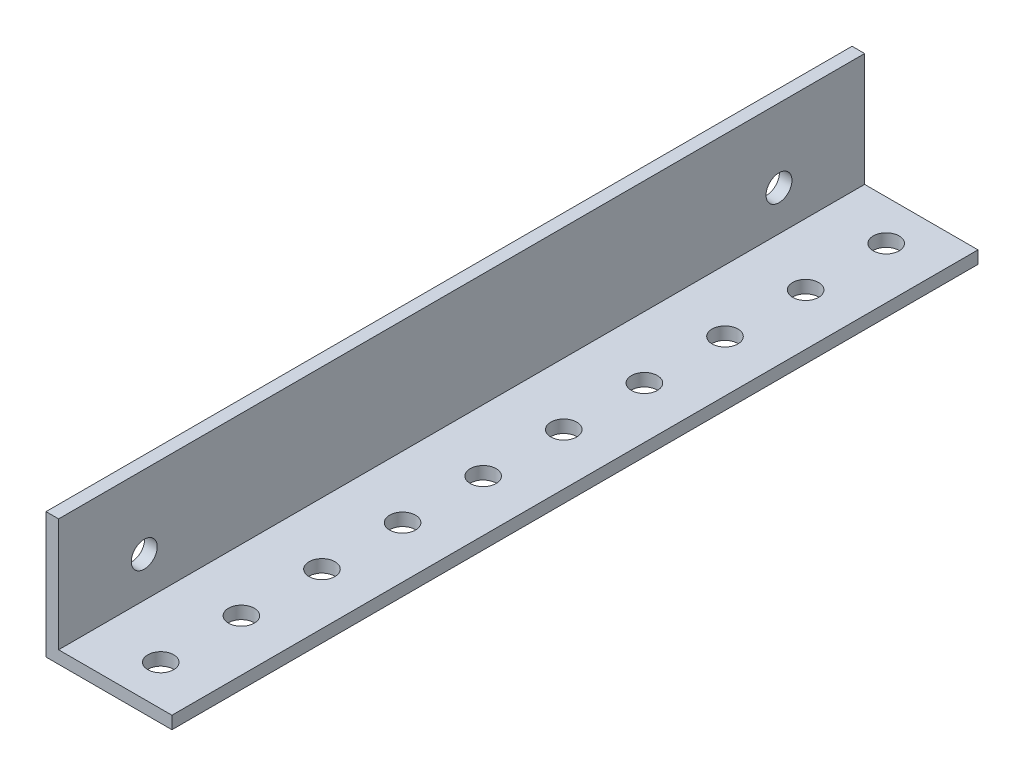
ISO-10303-21;
HEADER;
FILE_DESCRIPTION(('STEP AP214'),'2;1');
FILE_NAME('part.step','',(''),(''),'','','');
FILE_SCHEMA(('AUTOMOTIVE_DESIGN { 1 0 10303 214 1 1 1 1 }'));
ENDSEC;
DATA;
#1=APPLICATION_CONTEXT('core data for automotive mechanical design processes');
#2=APPLICATION_PROTOCOL_DEFINITION('international standard','automotive_design',2000,#1);
#3=PRODUCT_CONTEXT('',#1,'mechanical');
#4=PRODUCT('Part','Part','',(#3));
#5=PRODUCT_RELATED_PRODUCT_CATEGORY('part','',(#4));
#6=PRODUCT_DEFINITION_FORMATION('','',#4);
#7=PRODUCT_DEFINITION_CONTEXT('part definition',#1,'design');
#8=PRODUCT_DEFINITION('design','',#6,#7);
#9=PRODUCT_DEFINITION_SHAPE('','',#8);
#10=(LENGTH_UNIT() NAMED_UNIT(*) SI_UNIT(.MILLI.,.METRE.));
#11=(NAMED_UNIT(*) PLANE_ANGLE_UNIT() SI_UNIT($,.RADIAN.));
#12=(NAMED_UNIT(*) SI_UNIT($,.STERADIAN.) SOLID_ANGLE_UNIT());
#13=UNCERTAINTY_MEASURE_WITH_UNIT(LENGTH_MEASURE(1.E-05),#10,'distance_accuracy_value','');
#14=(GEOMETRIC_REPRESENTATION_CONTEXT(3) GLOBAL_UNCERTAINTY_ASSIGNED_CONTEXT((#13)) GLOBAL_UNIT_ASSIGNED_CONTEXT((#10,
#11,#12)) REPRESENTATION_CONTEXT('',''));
#15=CARTESIAN_POINT('',(0.,0.,0.));
#16=DIRECTION('',(0.,0.,1.));
#17=DIRECTION('',(1.,0.,0.));
#18=AXIS2_PLACEMENT_3D('',#15,#16,#17);
#19=CARTESIAN_POINT('',(1.5875,1.5875,50.8));
#20=DIRECTION('',(0.,-1.,0.));
#21=DIRECTION('',(1.,0.,0.));
#22=AXIS2_PLACEMENT_3D('',#19,#20,#21);
#23=PLANE('',#22);
#24=CARTESIAN_POINT('',(9.3853,1.5875,45.72));
#25=DIRECTION('',(0.,1.,0.));
#26=DIRECTION('',(0.,0.,1.));
#27=AXIS2_PLACEMENT_3D('',#24,#25,#26);
#28=CIRCLE('',#27,1.63194999999999);
#29=CARTESIAN_POINT('',(9.3853,1.5875,47.35195));
#30=VERTEX_POINT('',#29);
#31=EDGE_CURVE('E188',#30,#30,#28,.T.);
#32=ORIENTED_EDGE('',*,*,#31,.F.);
#33=EDGE_LOOP('',(#32));
#34=FACE_BOUND('',#33,.T.);
#35=CARTESIAN_POINT('',(9.3853,1.5875,35.56));
#36=DIRECTION('',(0.,1.,0.));
#37=DIRECTION('',(0.,0.,1.));
#38=AXIS2_PLACEMENT_3D('',#35,#36,#37);
#39=CIRCLE('',#38,1.63194999999999);
#40=CARTESIAN_POINT('',(9.3853,1.5875,37.19195));
#41=VERTEX_POINT('',#40);
#42=EDGE_CURVE('E198',#41,#41,#39,.T.);
#43=ORIENTED_EDGE('',*,*,#42,.F.);
#44=EDGE_LOOP('',(#43));
#45=FACE_BOUND('',#44,.T.);
#46=CARTESIAN_POINT('',(9.3853,1.5875,25.4));
#47=DIRECTION('',(0.,1.,0.));
#48=DIRECTION('',(0.,0.,1.));
#49=AXIS2_PLACEMENT_3D('',#46,#47,#48);
#50=CIRCLE('',#49,1.63194999999999);
#51=CARTESIAN_POINT('',(9.3853,1.5875,27.03195));
#52=VERTEX_POINT('',#51);
#53=EDGE_CURVE('E204',#52,#52,#50,.T.);
#54=ORIENTED_EDGE('',*,*,#53,.F.);
#55=EDGE_LOOP('',(#54));
#56=FACE_BOUND('',#55,.T.);
#57=CARTESIAN_POINT('',(9.3853,1.5875,15.24));
#58=DIRECTION('',(0.,1.,0.));
#59=DIRECTION('',(0.,0.,1.));
#60=AXIS2_PLACEMENT_3D('',#57,#58,#59);
#61=CIRCLE('',#60,1.63194999999999);
#62=CARTESIAN_POINT('',(9.3853,1.5875,16.87195));
#63=VERTEX_POINT('',#62);
#64=EDGE_CURVE('E210',#63,#63,#61,.T.);
#65=ORIENTED_EDGE('',*,*,#64,.F.);
#66=EDGE_LOOP('',(#65));
#67=FACE_BOUND('',#66,.T.);
#68=CARTESIAN_POINT('',(9.3853,1.5875,5.08000000000001));
#69=DIRECTION('',(0.,1.,0.));
#70=DIRECTION('',(0.,0.,1.));
#71=AXIS2_PLACEMENT_3D('',#68,#69,#70);
#72=CIRCLE('',#71,1.63194999999999);
#73=CARTESIAN_POINT('',(9.3853,1.5875,6.71195));
#74=VERTEX_POINT('',#73);
#75=EDGE_CURVE('E216',#74,#74,#72,.T.);
#76=ORIENTED_EDGE('',*,*,#75,.F.);
#77=EDGE_LOOP('',(#76));
#78=FACE_BOUND('',#77,.T.);
#79=DIRECTION('',(-1.,0.,0.));
#80=VECTOR('',#79,1.);
#81=CARTESIAN_POINT('',(1.5875,1.5875,-50.8));
#82=LINE('',#81,#80);
#83=CARTESIAN_POINT('',(15.875,1.5875,-50.8));
#84=VERTEX_POINT('',#83);
#85=CARTESIAN_POINT('',(1.5875,1.5875,-50.8));
#86=VERTEX_POINT('',#85);
#87=EDGE_CURVE('E127',#84,#86,#82,.T.);
#88=ORIENTED_EDGE('',*,*,#87,.T.);
#89=DIRECTION('',(0.,0.,-1.));
#90=VECTOR('',#89,1.);
#91=CARTESIAN_POINT('',(1.5875,1.5875,50.8));
#92=LINE('',#91,#90);
#93=CARTESIAN_POINT('',(1.5875,1.5875,50.8));
#94=VERTEX_POINT('',#93);
#95=EDGE_CURVE('E112',#94,#86,#92,.T.);
#96=ORIENTED_EDGE('',*,*,#95,.F.);
#97=DIRECTION('',(-1.,0.,0.));
#98=VECTOR('',#97,1.);
#99=CARTESIAN_POINT('',(1.5875,1.5875,50.8));
#100=LINE('',#99,#98);
#101=CARTESIAN_POINT('',(15.875,1.5875,50.8));
#102=VERTEX_POINT('',#101);
#103=EDGE_CURVE('E103',#102,#94,#100,.T.);
#104=ORIENTED_EDGE('',*,*,#103,.F.);
#105=DIRECTION('',(0.,0.,-1.));
#106=VECTOR('',#105,1.);
#107=CARTESIAN_POINT('',(15.875,1.5875,50.8));
#108=LINE('',#107,#106);
#109=EDGE_CURVE('E45',#102,#84,#108,.T.);
#110=ORIENTED_EDGE('',*,*,#109,.T.);
#111=EDGE_LOOP('',(#88,#96,#104,#110));
#112=FACE_BOUND('',#111,.T.);
#113=CARTESIAN_POINT('',(9.3853,1.5875,-45.72));
#114=DIRECTION('',(0.,1.,0.));
#115=DIRECTION('',(0.,0.,1.));
#116=AXIS2_PLACEMENT_3D('',#113,#114,#115);
#117=CIRCLE('',#116,1.63194999999999);
#118=CARTESIAN_POINT('',(9.3853,1.5875,-44.08805));
#119=VERTEX_POINT('',#118);
#120=EDGE_CURVE('E246',#119,#119,#117,.T.);
#121=ORIENTED_EDGE('',*,*,#120,.F.);
#122=EDGE_LOOP('',(#121));
#123=FACE_BOUND('',#122,.T.);
#124=CARTESIAN_POINT('',(9.3853,1.5875,-35.56));
#125=DIRECTION('',(0.,1.,0.));
#126=DIRECTION('',(0.,0.,1.));
#127=AXIS2_PLACEMENT_3D('',#124,#125,#126);
#128=CIRCLE('',#127,1.63194999999999);
#129=CARTESIAN_POINT('',(9.3853,1.5875,-33.92805));
#130=VERTEX_POINT('',#129);
#131=EDGE_CURVE('E240',#130,#130,#128,.T.);
#132=ORIENTED_EDGE('',*,*,#131,.F.);
#133=EDGE_LOOP('',(#132));
#134=FACE_BOUND('',#133,.T.);
#135=CARTESIAN_POINT('',(9.3853,1.5875,-25.4));
#136=DIRECTION('',(0.,1.,0.));
#137=DIRECTION('',(0.,0.,1.));
#138=AXIS2_PLACEMENT_3D('',#135,#136,#137);
#139=CIRCLE('',#138,1.63194999999999);
#140=CARTESIAN_POINT('',(9.3853,1.5875,-23.76805));
#141=VERTEX_POINT('',#140);
#142=EDGE_CURVE('E234',#141,#141,#139,.T.);
#143=ORIENTED_EDGE('',*,*,#142,.F.);
#144=EDGE_LOOP('',(#143));
#145=FACE_BOUND('',#144,.T.);
#146=CARTESIAN_POINT('',(9.3853,1.5875,-15.24));
#147=DIRECTION('',(0.,1.,0.));
#148=DIRECTION('',(0.,0.,1.));
#149=AXIS2_PLACEMENT_3D('',#146,#147,#148);
#150=CIRCLE('',#149,1.63194999999999);
#151=CARTESIAN_POINT('',(9.3853,1.5875,-13.60805));
#152=VERTEX_POINT('',#151);
#153=EDGE_CURVE('E228',#152,#152,#150,.T.);
#154=ORIENTED_EDGE('',*,*,#153,.F.);
#155=EDGE_LOOP('',(#154));
#156=FACE_BOUND('',#155,.T.);
#157=CARTESIAN_POINT('',(9.3853,1.5875,-5.07999999999999));
#158=DIRECTION('',(0.,1.,0.));
#159=DIRECTION('',(0.,0.,1.));
#160=AXIS2_PLACEMENT_3D('',#157,#158,#159);
#161=CIRCLE('',#160,1.63194999999999);
#162=CARTESIAN_POINT('',(9.3853,1.5875,-3.44805));
#163=VERTEX_POINT('',#162);
#164=EDGE_CURVE('E222',#163,#163,#161,.T.);
#165=ORIENTED_EDGE('',*,*,#164,.F.);
#166=EDGE_LOOP('',(#165));
#167=FACE_BOUND('',#166,.T.);
#168=ADVANCED_FACE('F36',(#34,#45,#56,#67,#78,#112,#123,#134,#145,#156,#167),#23,.F.);
#169=CARTESIAN_POINT('',(15.875,0.,50.8));
#170=DIRECTION('',(0.,1.,0.));
#171=DIRECTION('',(-1.,0.,0.));
#172=AXIS2_PLACEMENT_3D('',#169,#170,#171);
#173=PLANE('',#172);
#174=CARTESIAN_POINT('',(9.3853,0.,45.72));
#175=DIRECTION('',(0.,1.,0.));
#176=DIRECTION('',(-1.,0.,0.));
#177=AXIS2_PLACEMENT_3D('',#174,#175,#176);
#178=CIRCLE('',#177,1.63194999999999);
#179=CARTESIAN_POINT('',(7.75335000000001,0.,45.72));
#180=VERTEX_POINT('',#179);
#181=EDGE_CURVE('E195',#180,#180,#178,.T.);
#182=ORIENTED_EDGE('',*,*,#181,.T.);
#183=EDGE_LOOP('',(#182));
#184=FACE_BOUND('',#183,.T.);
#185=CARTESIAN_POINT('',(9.3853,0.,35.56));
#186=DIRECTION('',(0.,1.,0.));
#187=DIRECTION('',(-1.,0.,0.));
#188=AXIS2_PLACEMENT_3D('',#185,#186,#187);
#189=CIRCLE('',#188,1.63194999999999);
#190=CARTESIAN_POINT('',(7.75335000000001,0.,35.56));
#191=VERTEX_POINT('',#190);
#192=EDGE_CURVE('E201',#191,#191,#189,.T.);
#193=ORIENTED_EDGE('',*,*,#192,.T.);
#194=EDGE_LOOP('',(#193));
#195=FACE_BOUND('',#194,.T.);
#196=CARTESIAN_POINT('',(9.3853,0.,25.4));
#197=DIRECTION('',(0.,1.,0.));
#198=DIRECTION('',(-1.,0.,0.));
#199=AXIS2_PLACEMENT_3D('',#196,#197,#198);
#200=CIRCLE('',#199,1.63194999999999);
#201=CARTESIAN_POINT('',(7.75335000000001,0.,25.4));
#202=VERTEX_POINT('',#201);
#203=EDGE_CURVE('E207',#202,#202,#200,.T.);
#204=ORIENTED_EDGE('',*,*,#203,.T.);
#205=EDGE_LOOP('',(#204));
#206=FACE_BOUND('',#205,.T.);
#207=CARTESIAN_POINT('',(9.3853,0.,15.24));
#208=DIRECTION('',(0.,1.,0.));
#209=DIRECTION('',(-1.,0.,0.));
#210=AXIS2_PLACEMENT_3D('',#207,#208,#209);
#211=CIRCLE('',#210,1.63194999999999);
#212=CARTESIAN_POINT('',(7.75335000000001,0.,15.24));
#213=VERTEX_POINT('',#212);
#214=EDGE_CURVE('E213',#213,#213,#211,.T.);
#215=ORIENTED_EDGE('',*,*,#214,.T.);
#216=EDGE_LOOP('',(#215));
#217=FACE_BOUND('',#216,.T.);
#218=CARTESIAN_POINT('',(9.3853,0.,5.08000000000001));
#219=DIRECTION('',(0.,1.,0.));
#220=DIRECTION('',(-1.,0.,0.));
#221=AXIS2_PLACEMENT_3D('',#218,#219,#220);
#222=CIRCLE('',#221,1.63194999999999);
#223=CARTESIAN_POINT('',(7.75335000000001,0.,5.08000000000001));
#224=VERTEX_POINT('',#223);
#225=EDGE_CURVE('E219',#224,#224,#222,.T.);
#226=ORIENTED_EDGE('',*,*,#225,.T.);
#227=EDGE_LOOP('',(#226));
#228=FACE_BOUND('',#227,.T.);
#229=CARTESIAN_POINT('',(9.3853,0.,-5.07999999999999));
#230=DIRECTION('',(0.,1.,0.));
#231=DIRECTION('',(-1.,0.,0.));
#232=AXIS2_PLACEMENT_3D('',#229,#230,#231);
#233=CIRCLE('',#232,1.63194999999999);
#234=CARTESIAN_POINT('',(7.75335000000001,0.,-5.07999999999999));
#235=VERTEX_POINT('',#234);
#236=EDGE_CURVE('E225',#235,#235,#233,.T.);
#237=ORIENTED_EDGE('',*,*,#236,.T.);
#238=EDGE_LOOP('',(#237));
#239=FACE_BOUND('',#238,.T.);
#240=CARTESIAN_POINT('',(9.3853,0.,-15.24));
#241=DIRECTION('',(0.,1.,0.));
#242=DIRECTION('',(-1.,0.,0.));
#243=AXIS2_PLACEMENT_3D('',#240,#241,#242);
#244=CIRCLE('',#243,1.63194999999999);
#245=CARTESIAN_POINT('',(7.75335000000001,0.,-15.24));
#246=VERTEX_POINT('',#245);
#247=EDGE_CURVE('E231',#246,#246,#244,.T.);
#248=ORIENTED_EDGE('',*,*,#247,.T.);
#249=EDGE_LOOP('',(#248));
#250=FACE_BOUND('',#249,.T.);
#251=CARTESIAN_POINT('',(9.3853,0.,-25.4));
#252=DIRECTION('',(0.,1.,0.));
#253=DIRECTION('',(-1.,0.,0.));
#254=AXIS2_PLACEMENT_3D('',#251,#252,#253);
#255=CIRCLE('',#254,1.63194999999999);
#256=CARTESIAN_POINT('',(7.75335000000001,0.,-25.4));
#257=VERTEX_POINT('',#256);
#258=EDGE_CURVE('E237',#257,#257,#255,.T.);
#259=ORIENTED_EDGE('',*,*,#258,.T.);
#260=EDGE_LOOP('',(#259));
#261=FACE_BOUND('',#260,.T.);
#262=CARTESIAN_POINT('',(9.3853,0.,-35.56));
#263=DIRECTION('',(0.,1.,0.));
#264=DIRECTION('',(-1.,0.,0.));
#265=AXIS2_PLACEMENT_3D('',#262,#263,#264);
#266=CIRCLE('',#265,1.63194999999999);
#267=CARTESIAN_POINT('',(7.75335000000001,0.,-35.56));
#268=VERTEX_POINT('',#267);
#269=EDGE_CURVE('E243',#268,#268,#266,.T.);
#270=ORIENTED_EDGE('',*,*,#269,.T.);
#271=EDGE_LOOP('',(#270));
#272=FACE_BOUND('',#271,.T.);
#273=CARTESIAN_POINT('',(9.3853,0.,-45.72));
#274=DIRECTION('',(0.,1.,0.));
#275=DIRECTION('',(-1.,0.,0.));
#276=AXIS2_PLACEMENT_3D('',#273,#274,#275);
#277=CIRCLE('',#276,1.63194999999999);
#278=CARTESIAN_POINT('',(7.75335000000001,0.,-45.72));
#279=VERTEX_POINT('',#278);
#280=EDGE_CURVE('E125',#279,#279,#277,.T.);
#281=ORIENTED_EDGE('',*,*,#280,.T.);
#282=EDGE_LOOP('',(#281));
#283=FACE_BOUND('',#282,.T.);
#284=DIRECTION('',(1.,0.,0.));
#285=VECTOR('',#284,1.);
#286=CARTESIAN_POINT('',(15.875,0.,-50.8));
#287=LINE('',#286,#285);
#288=CARTESIAN_POINT('',(0.,0.,-50.8));
#289=VERTEX_POINT('',#288);
#290=CARTESIAN_POINT('',(15.875,0.,-50.8));
#291=VERTEX_POINT('',#290);
#292=EDGE_CURVE('E121',#289,#291,#287,.T.);
#293=ORIENTED_EDGE('',*,*,#292,.T.);
#294=DIRECTION('',(0.,0.,-1.));
#295=VECTOR('',#294,1.);
#296=CARTESIAN_POINT('',(15.875,0.,50.8));
#297=LINE('',#296,#295);
#298=CARTESIAN_POINT('',(15.875,0.,50.8));
#299=VERTEX_POINT('',#298);
#300=EDGE_CURVE('E11',#299,#291,#297,.T.);
#301=ORIENTED_EDGE('',*,*,#300,.F.);
#302=DIRECTION('',(1.,0.,0.));
#303=VECTOR('',#302,1.);
#304=CARTESIAN_POINT('',(15.875,0.,50.8));
#305=LINE('',#304,#303);
#306=CARTESIAN_POINT('',(0.,0.,50.8));
#307=VERTEX_POINT('',#306);
#308=EDGE_CURVE('E132',#307,#299,#305,.T.);
#309=ORIENTED_EDGE('',*,*,#308,.F.);
#310=DIRECTION('',(0.,0.,-1.));
#311=VECTOR('',#310,1.);
#312=CARTESIAN_POINT('',(0.,0.,50.8));
#313=LINE('',#312,#311);
#314=EDGE_CURVE('E117',#307,#289,#313,.T.);
#315=ORIENTED_EDGE('',*,*,#314,.T.);
#316=EDGE_LOOP('',(#293,#301,#309,#315));
#317=FACE_BOUND('',#316,.T.);
#318=ADVANCED_FACE('F38',(#184,#195,#206,#217,#228,#239,#250,#261,#272,#283,#317),#173,.F.);
#319=CARTESIAN_POINT('',(15.875,1.5875,50.8));
#320=DIRECTION('',(-1.,0.,0.));
#321=DIRECTION('',(0.,0.,1.));
#322=AXIS2_PLACEMENT_3D('',#319,#320,#321);
#323=PLANE('',#322);
#324=DIRECTION('',(0.,1.,0.));
#325=VECTOR('',#324,1.);
#326=CARTESIAN_POINT('',(15.875,1.5875,-50.8));
#327=LINE('',#326,#325);
#328=EDGE_CURVE('E124',#291,#84,#327,.T.);
#329=ORIENTED_EDGE('',*,*,#328,.T.);
#330=ORIENTED_EDGE('',*,*,#109,.F.);
#331=DIRECTION('',(0.,1.,0.));
#332=VECTOR('',#331,1.);
#333=CARTESIAN_POINT('',(15.875,1.5875,50.8));
#334=LINE('',#333,#332);
#335=EDGE_CURVE('E90',#299,#102,#334,.T.);
#336=ORIENTED_EDGE('',*,*,#335,.F.);
#337=ORIENTED_EDGE('',*,*,#300,.T.);
#338=EDGE_LOOP('',(#329,#330,#336,#337));
#339=FACE_BOUND('',#338,.T.);
#340=ADVANCED_FACE('F164',(#339),#323,.F.);
#341=CARTESIAN_POINT('',(1.5875,15.875,50.8));
#342=DIRECTION('',(-1.,0.,0.));
#343=DIRECTION('',(0.,-1.,0.));
#344=AXIS2_PLACEMENT_3D('',#341,#342,#343);
#345=PLANE('',#344);
#346=CARTESIAN_POINT('',(1.5875,6.62178,-40.005));
#347=DIRECTION('',(1.,0.,0.));
#348=DIRECTION('',(0.,0.,-1.));
#349=AXIS2_PLACEMENT_3D('',#346,#347,#348);
#350=CIRCLE('',#349,1.63194999999999);
#351=CARTESIAN_POINT('',(1.5875,6.62178,-41.63695));
#352=VERTEX_POINT('',#351);
#353=EDGE_CURVE('E179',#352,#352,#350,.T.);
#354=ORIENTED_EDGE('',*,*,#353,.F.);
#355=EDGE_LOOP('',(#354));
#356=FACE_BOUND('',#355,.T.);
#357=CARTESIAN_POINT('',(1.5875,6.62177999999999,40.005));
#358=DIRECTION('',(1.,0.,0.));
#359=DIRECTION('',(0.,0.,-1.));
#360=AXIS2_PLACEMENT_3D('',#357,#358,#359);
#361=CIRCLE('',#360,1.63194999999999);
#362=CARTESIAN_POINT('',(1.5875,6.62177999999999,38.37305));
#363=VERTEX_POINT('',#362);
#364=EDGE_CURVE('E182',#363,#363,#361,.T.);
#365=ORIENTED_EDGE('',*,*,#364,.F.);
#366=EDGE_LOOP('',(#365));
#367=FACE_BOUND('',#366,.T.);
#368=DIRECTION('',(0.,1.,0.));
#369=VECTOR('',#368,1.);
#370=CARTESIAN_POINT('',(1.5875,15.875,-50.8));
#371=LINE('',#370,#369);
#372=CARTESIAN_POINT('',(1.5875,15.875,-50.8));
#373=VERTEX_POINT('',#372);
#374=EDGE_CURVE('E111',#86,#373,#371,.T.);
#375=ORIENTED_EDGE('',*,*,#374,.T.);
#376=DIRECTION('',(0.,0.,-1.));
#377=VECTOR('',#376,1.);
#378=CARTESIAN_POINT('',(1.5875,15.875,50.8));
#379=LINE('',#378,#377);
#380=CARTESIAN_POINT('',(1.5875,15.875,50.8));
#381=VERTEX_POINT('',#380);
#382=EDGE_CURVE('E108',#381,#373,#379,.T.);
#383=ORIENTED_EDGE('',*,*,#382,.F.);
#384=DIRECTION('',(0.,1.,0.));
#385=VECTOR('',#384,1.);
#386=CARTESIAN_POINT('',(1.5875,15.875,50.8));
#387=LINE('',#386,#385);
#388=EDGE_CURVE('E97',#94,#381,#387,.T.);
#389=ORIENTED_EDGE('',*,*,#388,.F.);
#390=ORIENTED_EDGE('',*,*,#95,.T.);
#391=EDGE_LOOP('',(#375,#383,#389,#390));
#392=FACE_BOUND('',#391,.T.);
#393=ADVANCED_FACE('F109',(#356,#367,#392),#345,.F.);
#394=CARTESIAN_POINT('',(0.,15.875,50.8));
#395=DIRECTION('',(0.,-1.,0.));
#396=DIRECTION('',(0.,0.,-1.));
#397=AXIS2_PLACEMENT_3D('',#394,#395,#396);
#398=PLANE('',#397);
#399=DIRECTION('',(-1.,0.,0.));
#400=VECTOR('',#399,1.);
#401=CARTESIAN_POINT('',(0.,15.875,-50.8));
#402=LINE('',#401,#400);
#403=CARTESIAN_POINT('',(0.,15.875,-50.8));
#404=VERTEX_POINT('',#403);
#405=EDGE_CURVE('E76',#373,#404,#402,.T.);
#406=ORIENTED_EDGE('',*,*,#405,.T.);
#407=DIRECTION('',(0.,0.,-1.));
#408=VECTOR('',#407,1.);
#409=CARTESIAN_POINT('',(0.,15.875,50.8));
#410=LINE('',#409,#408);
#411=CARTESIAN_POINT('',(0.,15.875,50.8));
#412=VERTEX_POINT('',#411);
#413=EDGE_CURVE('E113',#412,#404,#410,.T.);
#414=ORIENTED_EDGE('',*,*,#413,.F.);
#415=DIRECTION('',(-1.,0.,0.));
#416=VECTOR('',#415,1.);
#417=CARTESIAN_POINT('',(0.,15.875,50.8));
#418=LINE('',#417,#416);
#419=EDGE_CURVE('E101',#381,#412,#418,.T.);
#420=ORIENTED_EDGE('',*,*,#419,.F.);
#421=ORIENTED_EDGE('',*,*,#382,.T.);
#422=EDGE_LOOP('',(#406,#414,#420,#421));
#423=FACE_BOUND('',#422,.T.);
#424=ADVANCED_FACE('F115',(#423),#398,.F.);
#425=CARTESIAN_POINT('',(0.,0.,50.8));
#426=DIRECTION('',(1.,0.,0.));
#427=DIRECTION('',(0.,0.,-1.));
#428=AXIS2_PLACEMENT_3D('',#425,#426,#427);
#429=PLANE('',#428);
#430=CARTESIAN_POINT('',(0.,6.62178,-40.005));
#431=DIRECTION('',(1.,0.,0.));
#432=DIRECTION('',(0.,0.,-1.));
#433=AXIS2_PLACEMENT_3D('',#430,#431,#432);
#434=CIRCLE('',#433,1.63194999999999);
#435=CARTESIAN_POINT('',(0.,6.62178,-41.63695));
#436=VERTEX_POINT('',#435);
#437=EDGE_CURVE('E185',#436,#436,#434,.T.);
#438=ORIENTED_EDGE('',*,*,#437,.T.);
#439=EDGE_LOOP('',(#438));
#440=FACE_BOUND('',#439,.T.);
#441=CARTESIAN_POINT('',(0.,6.62177999999999,40.005));
#442=DIRECTION('',(1.,0.,0.));
#443=DIRECTION('',(0.,0.,-1.));
#444=AXIS2_PLACEMENT_3D('',#441,#442,#443);
#445=CIRCLE('',#444,1.63194999999999);
#446=CARTESIAN_POINT('',(0.,6.62177999999999,38.37305));
#447=VERTEX_POINT('',#446);
#448=EDGE_CURVE('E184',#447,#447,#445,.T.);
#449=ORIENTED_EDGE('',*,*,#448,.T.);
#450=EDGE_LOOP('',(#449));
#451=FACE_BOUND('',#450,.T.);
#452=DIRECTION('',(0.,-1.,0.));
#453=VECTOR('',#452,1.);
#454=CARTESIAN_POINT('',(0.,0.,-50.8));
#455=LINE('',#454,#453);
#456=EDGE_CURVE('E82',#404,#289,#455,.T.);
#457=ORIENTED_EDGE('',*,*,#456,.T.);
#458=ORIENTED_EDGE('',*,*,#314,.F.);
#459=DIRECTION('',(0.,-1.,0.));
#460=VECTOR('',#459,1.);
#461=CARTESIAN_POINT('',(0.,0.,50.8));
#462=LINE('',#461,#460);
#463=EDGE_CURVE('E53',#412,#307,#462,.T.);
#464=ORIENTED_EDGE('',*,*,#463,.F.);
#465=ORIENTED_EDGE('',*,*,#413,.T.);
#466=EDGE_LOOP('',(#457,#458,#464,#465));
#467=FACE_BOUND('',#466,.T.);
#468=ADVANCED_FACE('F145',(#440,#451,#467),#429,.F.);
#469=CARTESIAN_POINT('',(0.,0.,50.8));
#470=DIRECTION('',(0.,0.,-1.));
#471=DIRECTION('',(-1.,0.,0.));
#472=AXIS2_PLACEMENT_3D('',#469,#470,#471);
#473=PLANE('',#472);
#474=ORIENTED_EDGE('',*,*,#308,.T.);
#475=ORIENTED_EDGE('',*,*,#335,.T.);
#476=ORIENTED_EDGE('',*,*,#103,.T.);
#477=ORIENTED_EDGE('',*,*,#388,.T.);
#478=ORIENTED_EDGE('',*,*,#419,.T.);
#479=ORIENTED_EDGE('',*,*,#463,.T.);
#480=EDGE_LOOP('',(#474,#475,#476,#477,#478,#479));
#481=FACE_BOUND('',#480,.T.);
#482=ADVANCED_FACE('F99',(#481),#473,.F.);
#483=CARTESIAN_POINT('',(0.,0.,-50.8));
#484=DIRECTION('',(0.,0.,-1.));
#485=DIRECTION('',(-1.,0.,0.));
#486=AXIS2_PLACEMENT_3D('',#483,#484,#485);
#487=PLANE('',#486);
#488=ORIENTED_EDGE('',*,*,#292,.F.);
#489=ORIENTED_EDGE('',*,*,#456,.F.);
#490=ORIENTED_EDGE('',*,*,#405,.F.);
#491=ORIENTED_EDGE('',*,*,#374,.F.);
#492=ORIENTED_EDGE('',*,*,#87,.F.);
#493=ORIENTED_EDGE('',*,*,#328,.F.);
#494=EDGE_LOOP('',(#488,#489,#490,#491,#492,#493));
#495=FACE_BOUND('',#494,.T.);
#496=ADVANCED_FACE('F141',(#495),#487,.T.);
#497=CARTESIAN_POINT('',(9.3853,1.5875,-45.72));
#498=DIRECTION('',(0.,1.,0.));
#499=DIRECTION('',(0.,0.,1.));
#500=AXIS2_PLACEMENT_3D('',#497,#498,#499);
#501=CYLINDRICAL_SURFACE('',#500,1.63194999999999);
#502=ORIENTED_EDGE('',*,*,#120,.T.);
#503=EDGE_LOOP('',(#502));
#504=FACE_BOUND('',#503,.T.);
#505=ORIENTED_EDGE('',*,*,#280,.F.);
#506=EDGE_LOOP('',(#505));
#507=FACE_BOUND('',#506,.T.);
#508=ADVANCED_FACE('F255',(#504,#507),#501,.F.);
#509=CARTESIAN_POINT('',(9.3853,1.5875,-35.56));
#510=DIRECTION('',(0.,1.,0.));
#511=DIRECTION('',(0.,0.,1.));
#512=AXIS2_PLACEMENT_3D('',#509,#510,#511);
#513=CYLINDRICAL_SURFACE('',#512,1.63194999999999);
#514=ORIENTED_EDGE('',*,*,#131,.T.);
#515=EDGE_LOOP('',(#514));
#516=FACE_BOUND('',#515,.T.);
#517=ORIENTED_EDGE('',*,*,#269,.F.);
#518=EDGE_LOOP('',(#517));
#519=FACE_BOUND('',#518,.T.);
#520=ADVANCED_FACE('F257',(#516,#519),#513,.F.);
#521=CARTESIAN_POINT('',(9.3853,1.5875,-25.4));
#522=DIRECTION('',(0.,1.,0.));
#523=DIRECTION('',(0.,0.,1.));
#524=AXIS2_PLACEMENT_3D('',#521,#522,#523);
#525=CYLINDRICAL_SURFACE('',#524,1.63194999999999);
#526=ORIENTED_EDGE('',*,*,#142,.T.);
#527=EDGE_LOOP('',(#526));
#528=FACE_BOUND('',#527,.T.);
#529=ORIENTED_EDGE('',*,*,#258,.F.);
#530=EDGE_LOOP('',(#529));
#531=FACE_BOUND('',#530,.T.);
#532=ADVANCED_FACE('F264',(#528,#531),#525,.F.);
#533=CARTESIAN_POINT('',(9.3853,1.5875,-15.24));
#534=DIRECTION('',(0.,1.,0.));
#535=DIRECTION('',(0.,0.,1.));
#536=AXIS2_PLACEMENT_3D('',#533,#534,#535);
#537=CYLINDRICAL_SURFACE('',#536,1.63194999999999);
#538=ORIENTED_EDGE('',*,*,#153,.T.);
#539=EDGE_LOOP('',(#538));
#540=FACE_BOUND('',#539,.T.);
#541=ORIENTED_EDGE('',*,*,#247,.F.);
#542=EDGE_LOOP('',(#541));
#543=FACE_BOUND('',#542,.T.);
#544=ADVANCED_FACE('F270',(#540,#543),#537,.F.);
#545=CARTESIAN_POINT('',(9.3853,1.5875,-5.07999999999999));
#546=DIRECTION('',(0.,1.,0.));
#547=DIRECTION('',(0.,0.,1.));
#548=AXIS2_PLACEMENT_3D('',#545,#546,#547);
#549=CYLINDRICAL_SURFACE('',#548,1.63194999999999);
#550=ORIENTED_EDGE('',*,*,#164,.T.);
#551=EDGE_LOOP('',(#550));
#552=FACE_BOUND('',#551,.T.);
#553=ORIENTED_EDGE('',*,*,#236,.F.);
#554=EDGE_LOOP('',(#553));
#555=FACE_BOUND('',#554,.T.);
#556=ADVANCED_FACE('F274',(#552,#555),#549,.F.);
#557=CARTESIAN_POINT('',(9.3853,1.5875,5.08000000000001));
#558=DIRECTION('',(0.,1.,0.));
#559=DIRECTION('',(0.,0.,1.));
#560=AXIS2_PLACEMENT_3D('',#557,#558,#559);
#561=CYLINDRICAL_SURFACE('',#560,1.63194999999999);
#562=ORIENTED_EDGE('',*,*,#75,.T.);
#563=EDGE_LOOP('',(#562));
#564=FACE_BOUND('',#563,.T.);
#565=ORIENTED_EDGE('',*,*,#225,.F.);
#566=EDGE_LOOP('',(#565));
#567=FACE_BOUND('',#566,.T.);
#568=ADVANCED_FACE('F278',(#564,#567),#561,.F.);
#569=CARTESIAN_POINT('',(9.3853,1.5875,15.24));
#570=DIRECTION('',(0.,1.,0.));
#571=DIRECTION('',(0.,0.,1.));
#572=AXIS2_PLACEMENT_3D('',#569,#570,#571);
#573=CYLINDRICAL_SURFACE('',#572,1.63194999999999);
#574=ORIENTED_EDGE('',*,*,#64,.T.);
#575=EDGE_LOOP('',(#574));
#576=FACE_BOUND('',#575,.T.);
#577=ORIENTED_EDGE('',*,*,#214,.F.);
#578=EDGE_LOOP('',(#577));
#579=FACE_BOUND('',#578,.T.);
#580=ADVANCED_FACE('F282',(#576,#579),#573,.F.);
#581=CARTESIAN_POINT('',(9.3853,1.5875,25.4));
#582=DIRECTION('',(0.,1.,0.));
#583=DIRECTION('',(0.,0.,1.));
#584=AXIS2_PLACEMENT_3D('',#581,#582,#583);
#585=CYLINDRICAL_SURFACE('',#584,1.63194999999999);
#586=ORIENTED_EDGE('',*,*,#53,.T.);
#587=EDGE_LOOP('',(#586));
#588=FACE_BOUND('',#587,.T.);
#589=ORIENTED_EDGE('',*,*,#203,.F.);
#590=EDGE_LOOP('',(#589));
#591=FACE_BOUND('',#590,.T.);
#592=ADVANCED_FACE('F286',(#588,#591),#585,.F.);
#593=CARTESIAN_POINT('',(9.3853,1.5875,35.56));
#594=DIRECTION('',(0.,1.,0.));
#595=DIRECTION('',(0.,0.,1.));
#596=AXIS2_PLACEMENT_3D('',#593,#594,#595);
#597=CYLINDRICAL_SURFACE('',#596,1.63194999999999);
#598=ORIENTED_EDGE('',*,*,#42,.T.);
#599=EDGE_LOOP('',(#598));
#600=FACE_BOUND('',#599,.T.);
#601=ORIENTED_EDGE('',*,*,#192,.F.);
#602=EDGE_LOOP('',(#601));
#603=FACE_BOUND('',#602,.T.);
#604=ADVANCED_FACE('F290',(#600,#603),#597,.F.);
#605=CARTESIAN_POINT('',(9.3853,1.5875,45.72));
#606=DIRECTION('',(0.,1.,0.));
#607=DIRECTION('',(0.,0.,1.));
#608=AXIS2_PLACEMENT_3D('',#605,#606,#607);
#609=CYLINDRICAL_SURFACE('',#608,1.63194999999999);
#610=ORIENTED_EDGE('',*,*,#31,.T.);
#611=EDGE_LOOP('',(#610));
#612=FACE_BOUND('',#611,.T.);
#613=ORIENTED_EDGE('',*,*,#181,.F.);
#614=EDGE_LOOP('',(#613));
#615=FACE_BOUND('',#614,.T.);
#616=ADVANCED_FACE('F294',(#612,#615),#609,.F.);
#617=CARTESIAN_POINT('',(1.5875,6.62177999999999,40.005));
#618=DIRECTION('',(1.,0.,0.));
#619=DIRECTION('',(0.,0.,-1.));
#620=AXIS2_PLACEMENT_3D('',#617,#618,#619);
#621=CYLINDRICAL_SURFACE('',#620,1.63194999999999);
#622=ORIENTED_EDGE('',*,*,#364,.T.);
#623=EDGE_LOOP('',(#622));
#624=FACE_BOUND('',#623,.T.);
#625=ORIENTED_EDGE('',*,*,#448,.F.);
#626=EDGE_LOOP('',(#625));
#627=FACE_BOUND('',#626,.T.);
#628=ADVANCED_FACE('F298',(#624,#627),#621,.F.);
#629=CARTESIAN_POINT('',(1.5875,6.62178,-40.005));
#630=DIRECTION('',(1.,0.,0.));
#631=DIRECTION('',(0.,0.,-1.));
#632=AXIS2_PLACEMENT_3D('',#629,#630,#631);
#633=CYLINDRICAL_SURFACE('',#632,1.63194999999999);
#634=ORIENTED_EDGE('',*,*,#353,.T.);
#635=EDGE_LOOP('',(#634));
#636=FACE_BOUND('',#635,.T.);
#637=ORIENTED_EDGE('',*,*,#437,.F.);
#638=EDGE_LOOP('',(#637));
#639=FACE_BOUND('',#638,.T.);
#640=ADVANCED_FACE('F302',(#636,#639),#633,.F.);
#641=CLOSED_SHELL('',(#168,#318,#340,#393,#424,#468,#482,#496,#508,#520,#532,#544,#556,#568,
#580,#592,#604,#616,#628,#640));
#642=MANIFOLD_SOLID_BREP('B2',#641);
#643=ADVANCED_BREP_SHAPE_REPRESENTATION('',(#18,#642),#14);
#644=SHAPE_DEFINITION_REPRESENTATION(#9,#643);
ENDSEC;
END-ISO-10303-21;
